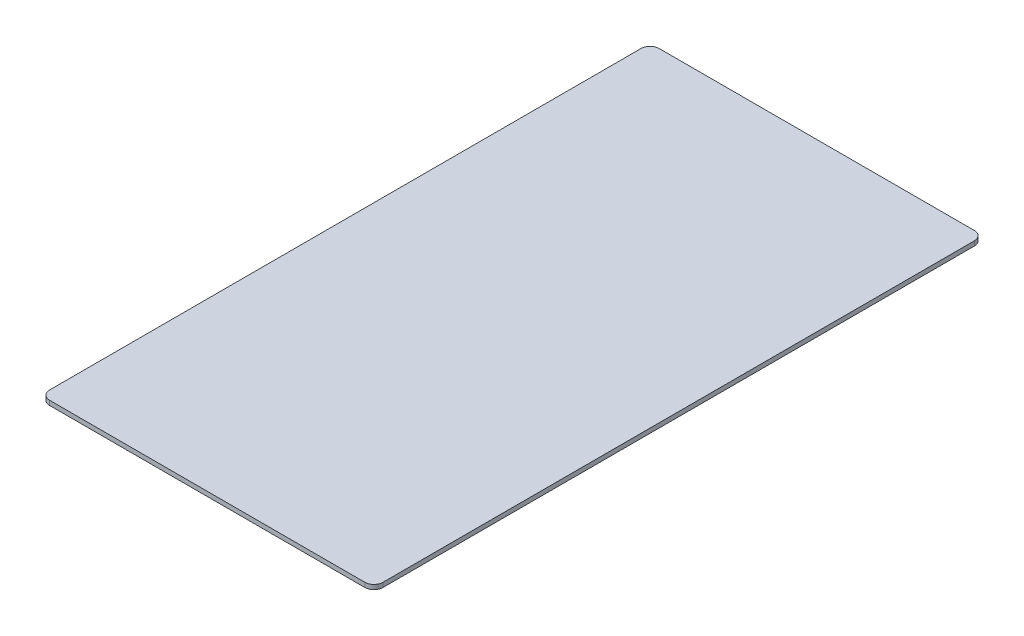
ISO-10303-21;
HEADER;
FILE_DESCRIPTION(('STEP AP214'),'2;1');
FILE_NAME('part.step','',(''),(''),'','','');
FILE_SCHEMA(('AUTOMOTIVE_DESIGN { 1 0 10303 214 1 1 1 1 }'));
ENDSEC;
DATA;
#1=APPLICATION_CONTEXT('core data for automotive mechanical design processes');
#2=APPLICATION_PROTOCOL_DEFINITION('international standard','automotive_design',2000,#1);
#3=PRODUCT_CONTEXT('',#1,'mechanical');
#4=PRODUCT('Part','Part','',(#3));
#5=PRODUCT_RELATED_PRODUCT_CATEGORY('part','',(#4));
#6=PRODUCT_DEFINITION_FORMATION('','',#4);
#7=PRODUCT_DEFINITION_CONTEXT('part definition',#1,'design');
#8=PRODUCT_DEFINITION('design','',#6,#7);
#9=PRODUCT_DEFINITION_SHAPE('','',#8);
#10=(LENGTH_UNIT() NAMED_UNIT(*) SI_UNIT(.MILLI.,.METRE.));
#11=(NAMED_UNIT(*) PLANE_ANGLE_UNIT() SI_UNIT($,.RADIAN.));
#12=(NAMED_UNIT(*) SI_UNIT($,.STERADIAN.) SOLID_ANGLE_UNIT());
#13=UNCERTAINTY_MEASURE_WITH_UNIT(LENGTH_MEASURE(1.E-05),#10,'distance_accuracy_value','');
#14=(GEOMETRIC_REPRESENTATION_CONTEXT(3) GLOBAL_UNCERTAINTY_ASSIGNED_CONTEXT((#13)) GLOBAL_UNIT_ASSIGNED_CONTEXT((#10,
#11,#12)) REPRESENTATION_CONTEXT('',''));
#15=CARTESIAN_POINT('',(0.,0.,0.));
#16=DIRECTION('',(0.,0.,1.));
#17=DIRECTION('',(1.,0.,0.));
#18=AXIS2_PLACEMENT_3D('',#15,#16,#17);
#19=CARTESIAN_POINT('',(-348.,-10.,-653.));
#20=DIRECTION('',(0.,1.,0.));
#21=DIRECTION('',(0.,0.,1.));
#22=AXIS2_PLACEMENT_3D('',#19,#20,#21);
#23=CYLINDRICAL_SURFACE('',#22,20.);
#24=CARTESIAN_POINT('',(-348.,-10.,-653.));
#25=DIRECTION('',(0.,-1.,0.));
#26=DIRECTION('',(0.,0.,-1.));
#27=AXIS2_PLACEMENT_3D('',#24,#25,#26);
#28=CIRCLE('',#27,20.);
#29=CARTESIAN_POINT('',(-368.,-10.,-653.));
#30=VERTEX_POINT('',#29);
#31=CARTESIAN_POINT('',(-348.,-10.,-673.));
#32=VERTEX_POINT('',#31);
#33=EDGE_CURVE('E137',#30,#32,#28,.T.);
#34=ORIENTED_EDGE('',*,*,#33,.F.);
#35=DIRECTION('',(0.,-1.,0.));
#36=VECTOR('',#35,1.);
#37=CARTESIAN_POINT('',(-368.,-10.,-653.));
#38=LINE('',#37,#36);
#39=CARTESIAN_POINT('',(-368.,0.,-653.));
#40=VERTEX_POINT('',#39);
#41=EDGE_CURVE('E107',#40,#30,#38,.T.);
#42=ORIENTED_EDGE('',*,*,#41,.F.);
#43=CARTESIAN_POINT('',(-348.,0.,-653.));
#44=DIRECTION('',(0.,1.,0.));
#45=DIRECTION('',(0.,0.,-1.));
#46=AXIS2_PLACEMENT_3D('',#43,#44,#45);
#47=CIRCLE('',#46,20.);
#48=CARTESIAN_POINT('',(-348.,0.,-673.));
#49=VERTEX_POINT('',#48);
#50=EDGE_CURVE('E101',#49,#40,#47,.T.);
#51=ORIENTED_EDGE('',*,*,#50,.F.);
#52=DIRECTION('',(0.,1.,0.));
#53=VECTOR('',#52,1.);
#54=CARTESIAN_POINT('',(-348.,-10.,-673.));
#55=LINE('',#54,#53);
#56=EDGE_CURVE('E104',#32,#49,#55,.T.);
#57=ORIENTED_EDGE('',*,*,#56,.F.);
#58=EDGE_LOOP('',(#34,#42,#51,#57));
#59=FACE_BOUND('',#58,.T.);
#60=ADVANCED_FACE('F17',(#59),#23,.T.);
#61=CARTESIAN_POINT('',(348.,-10.,-653.));
#62=DIRECTION('',(0.,1.,0.));
#63=DIRECTION('',(0.,0.,1.));
#64=AXIS2_PLACEMENT_3D('',#61,#62,#63);
#65=CYLINDRICAL_SURFACE('',#64,20.);
#66=CARTESIAN_POINT('',(348.,-10.,-653.));
#67=DIRECTION('',(0.,-1.,0.));
#68=DIRECTION('',(0.,0.,-1.));
#69=AXIS2_PLACEMENT_3D('',#66,#67,#68);
#70=CIRCLE('',#69,20.);
#71=CARTESIAN_POINT('',(348.,-10.,-673.));
#72=VERTEX_POINT('',#71);
#73=CARTESIAN_POINT('',(368.,-10.,-653.));
#74=VERTEX_POINT('',#73);
#75=EDGE_CURVE('E144',#72,#74,#70,.T.);
#76=ORIENTED_EDGE('',*,*,#75,.F.);
#77=DIRECTION('',(0.,-1.,0.));
#78=VECTOR('',#77,1.);
#79=CARTESIAN_POINT('',(348.,-10.,-673.));
#80=LINE('',#79,#78);
#81=CARTESIAN_POINT('',(348.,0.,-673.));
#82=VERTEX_POINT('',#81);
#83=EDGE_CURVE('E121',#82,#72,#80,.T.);
#84=ORIENTED_EDGE('',*,*,#83,.F.);
#85=CARTESIAN_POINT('',(348.,0.,-653.));
#86=DIRECTION('',(0.,1.,0.));
#87=DIRECTION('',(0.,0.,-1.));
#88=AXIS2_PLACEMENT_3D('',#85,#86,#87);
#89=CIRCLE('',#88,20.);
#90=CARTESIAN_POINT('',(368.,0.,-653.));
#91=VERTEX_POINT('',#90);
#92=EDGE_CURVE('E11',#91,#82,#89,.T.);
#93=ORIENTED_EDGE('',*,*,#92,.F.);
#94=DIRECTION('',(0.,1.,0.));
#95=VECTOR('',#94,1.);
#96=CARTESIAN_POINT('',(368.,-10.,-653.));
#97=LINE('',#96,#95);
#98=EDGE_CURVE('E143',#74,#91,#97,.T.);
#99=ORIENTED_EDGE('',*,*,#98,.F.);
#100=EDGE_LOOP('',(#76,#84,#93,#99));
#101=FACE_BOUND('',#100,.T.);
#102=ADVANCED_FACE('F263',(#101),#65,.T.);
#103=CARTESIAN_POINT('',(-348.,-10.,653.));
#104=DIRECTION('',(0.,1.,0.));
#105=DIRECTION('',(0.,0.,1.));
#106=AXIS2_PLACEMENT_3D('',#103,#104,#105);
#107=CYLINDRICAL_SURFACE('',#106,20.);
#108=CARTESIAN_POINT('',(-348.,-10.,653.));
#109=DIRECTION('',(0.,-1.,0.));
#110=DIRECTION('',(0.,0.,-1.));
#111=AXIS2_PLACEMENT_3D('',#108,#109,#110);
#112=CIRCLE('',#111,20.);
#113=CARTESIAN_POINT('',(-348.,-10.,673.));
#114=VERTEX_POINT('',#113);
#115=CARTESIAN_POINT('',(-368.,-10.,653.));
#116=VERTEX_POINT('',#115);
#117=EDGE_CURVE('E41',#114,#116,#112,.T.);
#118=ORIENTED_EDGE('',*,*,#117,.F.);
#119=DIRECTION('',(0.,-1.,0.));
#120=VECTOR('',#119,1.);
#121=CARTESIAN_POINT('',(-348.,-10.,673.));
#122=LINE('',#121,#120);
#123=CARTESIAN_POINT('',(-348.,0.,673.));
#124=VERTEX_POINT('',#123);
#125=EDGE_CURVE('E173',#124,#114,#122,.T.);
#126=ORIENTED_EDGE('',*,*,#125,.F.);
#127=CARTESIAN_POINT('',(-348.,0.,653.));
#128=DIRECTION('',(0.,1.,0.));
#129=DIRECTION('',(0.,0.,-1.));
#130=AXIS2_PLACEMENT_3D('',#127,#128,#129);
#131=CIRCLE('',#130,20.);
#132=CARTESIAN_POINT('',(-368.,0.,653.));
#133=VERTEX_POINT('',#132);
#134=EDGE_CURVE('E21',#133,#124,#131,.T.);
#135=ORIENTED_EDGE('',*,*,#134,.F.);
#136=DIRECTION('',(0.,1.,0.));
#137=VECTOR('',#136,1.);
#138=CARTESIAN_POINT('',(-368.,-10.,653.));
#139=LINE('',#138,#137);
#140=EDGE_CURVE('E133',#116,#133,#139,.T.);
#141=ORIENTED_EDGE('',*,*,#140,.F.);
#142=EDGE_LOOP('',(#118,#126,#135,#141));
#143=FACE_BOUND('',#142,.T.);
#144=ADVANCED_FACE('F200',(#143),#107,.T.);
#145=CARTESIAN_POINT('',(348.,-10.,653.));
#146=DIRECTION('',(0.,1.,0.));
#147=DIRECTION('',(0.,0.,1.));
#148=AXIS2_PLACEMENT_3D('',#145,#146,#147);
#149=CYLINDRICAL_SURFACE('',#148,20.);
#150=CARTESIAN_POINT('',(348.,-10.,653.));
#151=DIRECTION('',(0.,-1.,0.));
#152=DIRECTION('',(0.,0.,-1.));
#153=AXIS2_PLACEMENT_3D('',#150,#151,#152);
#154=CIRCLE('',#153,20.);
#155=CARTESIAN_POINT('',(368.,-10.,653.));
#156=VERTEX_POINT('',#155);
#157=CARTESIAN_POINT('',(348.,-10.,673.));
#158=VERTEX_POINT('',#157);
#159=EDGE_CURVE('E147',#156,#158,#154,.T.);
#160=ORIENTED_EDGE('',*,*,#159,.F.);
#161=DIRECTION('',(0.,-1.,0.));
#162=VECTOR('',#161,1.);
#163=CARTESIAN_POINT('',(368.,-10.,653.));
#164=LINE('',#163,#162);
#165=CARTESIAN_POINT('',(368.,0.,653.));
#166=VERTEX_POINT('',#165);
#167=EDGE_CURVE('E156',#166,#156,#164,.T.);
#168=ORIENTED_EDGE('',*,*,#167,.F.);
#169=CARTESIAN_POINT('',(348.,0.,653.));
#170=DIRECTION('',(0.,1.,0.));
#171=DIRECTION('',(0.,0.,-1.));
#172=AXIS2_PLACEMENT_3D('',#169,#170,#171);
#173=CIRCLE('',#172,20.);
#174=CARTESIAN_POINT('',(348.,0.,673.));
#175=VERTEX_POINT('',#174);
#176=EDGE_CURVE('E28',#175,#166,#173,.T.);
#177=ORIENTED_EDGE('',*,*,#176,.F.);
#178=DIRECTION('',(0.,1.,0.));
#179=VECTOR('',#178,1.);
#180=CARTESIAN_POINT('',(348.,-10.,673.));
#181=LINE('',#180,#179);
#182=EDGE_CURVE('E166',#158,#175,#181,.T.);
#183=ORIENTED_EDGE('',*,*,#182,.F.);
#184=EDGE_LOOP('',(#160,#168,#177,#183));
#185=FACE_BOUND('',#184,.T.);
#186=ADVANCED_FACE('F259',(#185),#149,.T.);
#187=CARTESIAN_POINT('',(0.,0.,0.));
#188=DIRECTION('',(0.,-1.,0.));
#189=DIRECTION('',(0.,0.,-1.));
#190=AXIS2_PLACEMENT_3D('',#187,#188,#189);
#191=PLANE('',#190);
#192=DIRECTION('',(1.,0.,0.));
#193=VECTOR('',#192,1.);
#194=CARTESIAN_POINT('',(-368.,0.,-673.));
#195=LINE('',#194,#193);
#196=EDGE_CURVE('E114',#49,#82,#195,.T.);
#197=ORIENTED_EDGE('',*,*,#196,.F.);
#198=ORIENTED_EDGE('',*,*,#50,.T.);
#199=DIRECTION('',(0.,0.,-1.));
#200=VECTOR('',#199,1.);
#201=CARTESIAN_POINT('',(-368.,0.,673.));
#202=LINE('',#201,#200);
#203=EDGE_CURVE('E163',#133,#40,#202,.T.);
#204=ORIENTED_EDGE('',*,*,#203,.F.);
#205=ORIENTED_EDGE('',*,*,#134,.T.);
#206=DIRECTION('',(-1.,0.,0.));
#207=VECTOR('',#206,1.);
#208=CARTESIAN_POINT('',(368.,0.,673.));
#209=LINE('',#208,#207);
#210=EDGE_CURVE('E160',#175,#124,#209,.T.);
#211=ORIENTED_EDGE('',*,*,#210,.F.);
#212=ORIENTED_EDGE('',*,*,#176,.T.);
#213=DIRECTION('',(0.,0.,1.));
#214=VECTOR('',#213,1.);
#215=CARTESIAN_POINT('',(368.,0.,-673.));
#216=LINE('',#215,#214);
#217=EDGE_CURVE('E155',#91,#166,#216,.T.);
#218=ORIENTED_EDGE('',*,*,#217,.F.);
#219=ORIENTED_EDGE('',*,*,#92,.T.);
#220=EDGE_LOOP('',(#197,#198,#204,#205,#211,#212,#218,#219));
#221=FACE_BOUND('',#220,.T.);
#222=ADVANCED_FACE('F115',(#221),#191,.F.);
#223=CARTESIAN_POINT('',(0.,-10.,0.));
#224=DIRECTION('',(0.,-1.,0.));
#225=DIRECTION('',(0.,0.,-1.));
#226=AXIS2_PLACEMENT_3D('',#223,#224,#225);
#227=PLANE('',#226);
#228=DIRECTION('',(0.,0.,-1.));
#229=VECTOR('',#228,1.);
#230=CARTESIAN_POINT('',(-368.,-10.,673.));
#231=LINE('',#230,#229);
#232=EDGE_CURVE('E138',#116,#30,#231,.T.);
#233=ORIENTED_EDGE('',*,*,#232,.T.);
#234=ORIENTED_EDGE('',*,*,#33,.T.);
#235=DIRECTION('',(1.,0.,0.));
#236=VECTOR('',#235,1.);
#237=CARTESIAN_POINT('',(-368.,-10.,-673.));
#238=LINE('',#237,#236);
#239=EDGE_CURVE('E125',#32,#72,#238,.T.);
#240=ORIENTED_EDGE('',*,*,#239,.T.);
#241=ORIENTED_EDGE('',*,*,#75,.T.);
#242=DIRECTION('',(0.,0.,1.));
#243=VECTOR('',#242,1.);
#244=CARTESIAN_POINT('',(368.,-10.,-673.));
#245=LINE('',#244,#243);
#246=EDGE_CURVE('E139',#74,#156,#245,.T.);
#247=ORIENTED_EDGE('',*,*,#246,.T.);
#248=ORIENTED_EDGE('',*,*,#159,.T.);
#249=DIRECTION('',(-1.,0.,0.));
#250=VECTOR('',#249,1.);
#251=CARTESIAN_POINT('',(368.,-10.,673.));
#252=LINE('',#251,#250);
#253=EDGE_CURVE('E171',#158,#114,#252,.T.);
#254=ORIENTED_EDGE('',*,*,#253,.T.);
#255=ORIENTED_EDGE('',*,*,#117,.T.);
#256=EDGE_LOOP('',(#233,#234,#240,#241,#247,#248,#254,#255));
#257=FACE_BOUND('',#256,.T.);
#258=ADVANCED_FACE('F257',(#257),#227,.T.);
#259=CARTESIAN_POINT('',(-368.,-10.,673.));
#260=DIRECTION('',(1.,0.,0.));
#261=DIRECTION('',(0.,1.,0.));
#262=AXIS2_PLACEMENT_3D('',#259,#260,#261);
#263=PLANE('',#262);
#264=ORIENTED_EDGE('',*,*,#203,.T.);
#265=ORIENTED_EDGE('',*,*,#41,.T.);
#266=ORIENTED_EDGE('',*,*,#232,.F.);
#267=ORIENTED_EDGE('',*,*,#140,.T.);
#268=EDGE_LOOP('',(#264,#265,#266,#267));
#269=FACE_BOUND('',#268,.T.);
#270=ADVANCED_FACE('F265',(#269),#263,.F.);
#271=CARTESIAN_POINT('',(368.,-10.,673.));
#272=DIRECTION('',(0.,0.,-1.));
#273=DIRECTION('',(0.,-1.,0.));
#274=AXIS2_PLACEMENT_3D('',#271,#272,#273);
#275=PLANE('',#274);
#276=ORIENTED_EDGE('',*,*,#210,.T.);
#277=ORIENTED_EDGE('',*,*,#125,.T.);
#278=ORIENTED_EDGE('',*,*,#253,.F.);
#279=ORIENTED_EDGE('',*,*,#182,.T.);
#280=EDGE_LOOP('',(#276,#277,#278,#279));
#281=FACE_BOUND('',#280,.T.);
#282=ADVANCED_FACE('F194',(#281),#275,.F.);
#283=CARTESIAN_POINT('',(368.,-10.,-673.));
#284=DIRECTION('',(-1.,0.,0.));
#285=DIRECTION('',(0.,0.,1.));
#286=AXIS2_PLACEMENT_3D('',#283,#284,#285);
#287=PLANE('',#286);
#288=ORIENTED_EDGE('',*,*,#246,.F.);
#289=ORIENTED_EDGE('',*,*,#98,.T.);
#290=ORIENTED_EDGE('',*,*,#217,.T.);
#291=ORIENTED_EDGE('',*,*,#167,.T.);
#292=EDGE_LOOP('',(#288,#289,#290,#291));
#293=FACE_BOUND('',#292,.T.);
#294=ADVANCED_FACE('F19',(#293),#287,.F.);
#295=CARTESIAN_POINT('',(-368.,-10.,-673.));
#296=DIRECTION('',(0.,0.,1.));
#297=DIRECTION('',(1.,0.,0.));
#298=AXIS2_PLACEMENT_3D('',#295,#296,#297);
#299=PLANE('',#298);
#300=ORIENTED_EDGE('',*,*,#239,.F.);
#301=ORIENTED_EDGE('',*,*,#56,.T.);
#302=ORIENTED_EDGE('',*,*,#196,.T.);
#303=ORIENTED_EDGE('',*,*,#83,.T.);
#304=EDGE_LOOP('',(#300,#301,#302,#303));
#305=FACE_BOUND('',#304,.T.);
#306=ADVANCED_FACE('F123',(#305),#299,.F.);
#307=CLOSED_SHELL('',(#60,#102,#144,#186,#222,#258,#270,#282,#294,#306));
#308=MANIFOLD_SOLID_BREP('B1',#307);
#309=ADVANCED_BREP_SHAPE_REPRESENTATION('',(#18,#308),#14);
#310=SHAPE_DEFINITION_REPRESENTATION(#9,#309);
ENDSEC;
END-ISO-10303-21;
